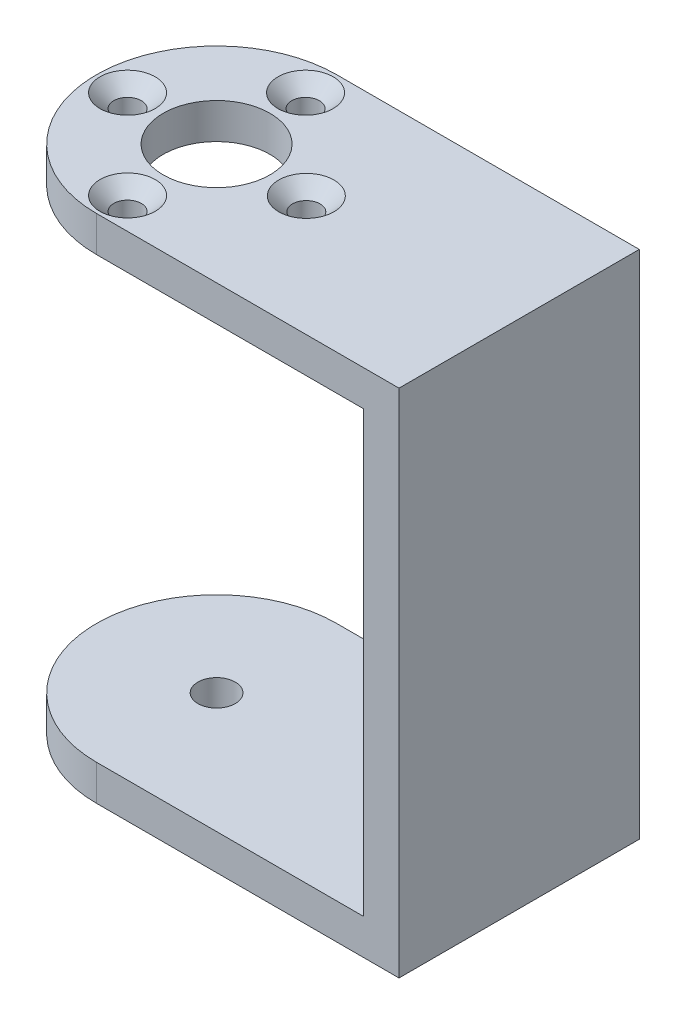
ISO-10303-21;
HEADER;
FILE_DESCRIPTION(('STEP AP214'),'2;1');
FILE_NAME('part.step','',(''),(''),'','','');
FILE_SCHEMA(('AUTOMOTIVE_DESIGN { 1 0 10303 214 1 1 1 1 }'));
ENDSEC;
DATA;
#1=APPLICATION_CONTEXT('core data for automotive mechanical design processes');
#2=APPLICATION_PROTOCOL_DEFINITION('international standard','automotive_design',2000,#1);
#3=PRODUCT_CONTEXT('',#1,'mechanical');
#4=PRODUCT('Part','Part','',(#3));
#5=PRODUCT_RELATED_PRODUCT_CATEGORY('part','',(#4));
#6=PRODUCT_DEFINITION_FORMATION('','',#4);
#7=PRODUCT_DEFINITION_CONTEXT('part definition',#1,'design');
#8=PRODUCT_DEFINITION('design','',#6,#7);
#9=PRODUCT_DEFINITION_SHAPE('','',#8);
#10=(LENGTH_UNIT() NAMED_UNIT(*) SI_UNIT(.MILLI.,.METRE.));
#11=(NAMED_UNIT(*) PLANE_ANGLE_UNIT() SI_UNIT($,.RADIAN.));
#12=(NAMED_UNIT(*) SI_UNIT($,.STERADIAN.) SOLID_ANGLE_UNIT());
#13=UNCERTAINTY_MEASURE_WITH_UNIT(LENGTH_MEASURE(1.E-05),#10,'distance_accuracy_value','');
#14=(GEOMETRIC_REPRESENTATION_CONTEXT(3) GLOBAL_UNCERTAINTY_ASSIGNED_CONTEXT((#13)) GLOBAL_UNIT_ASSIGNED_CONTEXT((#10,
#11,#12)) REPRESENTATION_CONTEXT('',''));
#15=CARTESIAN_POINT('',(0.,0.,0.));
#16=DIRECTION('',(0.,0.,1.));
#17=DIRECTION('',(1.,0.,0.));
#18=AXIS2_PLACEMENT_3D('',#15,#16,#17);
#19=CARTESIAN_POINT('',(22.8357313979077,-29.6397523900537,-4.21317592186477));
#20=DIRECTION('',(0.,-1.,0.));
#21=DIRECTION('',(0.,0.,-1.));
#22=AXIS2_PLACEMENT_3D('',#19,#20,#21);
#23=CYLINDRICAL_SURFACE('',#22,2.1);
#24=CARTESIAN_POINT('',(22.8357313979077,-25.6397523900537,-4.21317592186477));
#25=DIRECTION('',(0.,-1.,0.));
#26=DIRECTION('',(0.,0.,-1.));
#27=AXIS2_PLACEMENT_3D('',#24,#25,#26);
#28=CIRCLE('',#27,2.1);
#29=CARTESIAN_POINT('',(22.8357313979077,-25.6397523900537,-6.31317592186477));
#30=VERTEX_POINT('',#29);
#31=EDGE_CURVE('E396',#30,#30,#28,.F.);
#32=ORIENTED_EDGE('',*,*,#31,.T.);
#33=EDGE_LOOP('',(#32));
#34=FACE_BOUND('',#33,.T.);
#35=CARTESIAN_POINT('',(22.8357313979077,-28.6397523900537,-4.21317592186477));
#36=DIRECTION('',(0.,-1.,0.));
#37=DIRECTION('',(0.,0.,-1.));
#38=AXIS2_PLACEMENT_3D('',#35,#36,#37);
#39=CIRCLE('',#38,2.1);
#40=CARTESIAN_POINT('',(22.8357313979077,-28.6397523900537,-6.31317592186477));
#41=VERTEX_POINT('',#40);
#42=EDGE_CURVE('E143',#41,#41,#39,.F.);
#43=ORIENTED_EDGE('',*,*,#42,.F.);
#44=EDGE_LOOP('',(#43));
#45=FACE_BOUND('',#44,.T.);
#46=ADVANCED_FACE('F59',(#34,#45),#23,.F.);
#47=CARTESIAN_POINT('',(52.8357313979077,0.,0.));
#48=DIRECTION('',(1.,0.,0.));
#49=DIRECTION('',(0.,0.,-1.));
#50=AXIS2_PLACEMENT_3D('',#47,#48,#49);
#51=PLANE('',#50);
#52=DIRECTION('',(0.,0.,1.));
#53=VECTOR('',#52,1.);
#54=CARTESIAN_POINT('',(52.8357313979077,23.7602476099463,-17.7131759218648));
#55=LINE('',#54,#53);
#56=CARTESIAN_POINT('',(52.8357313979077,23.7602476099463,-17.7131759218648));
#57=VERTEX_POINT('',#56);
#58=CARTESIAN_POINT('',(52.8357313979077,23.7602476099463,9.28682407813523));
#59=VERTEX_POINT('',#58);
#60=EDGE_CURVE('E196',#57,#59,#55,.T.);
#61=ORIENTED_EDGE('',*,*,#60,.F.);
#62=DIRECTION('',(0.,1.,0.));
#63=VECTOR('',#62,1.);
#64=CARTESIAN_POINT('',(52.8357313979077,27.7602476099463,-17.7131759218648));
#65=LINE('',#64,#63);
#66=CARTESIAN_POINT('',(52.8357313979077,-25.6397523900537,-17.7131759218648));
#67=VERTEX_POINT('',#66);
#68=EDGE_CURVE('E236',#67,#57,#65,.T.);
#69=ORIENTED_EDGE('',*,*,#68,.F.);
#70=DIRECTION('',(0.,0.,1.));
#71=VECTOR('',#70,1.);
#72=CARTESIAN_POINT('',(52.8357313979077,-25.6397523900537,-17.7131759218648));
#73=LINE('',#72,#71);
#74=CARTESIAN_POINT('',(52.8357313979077,-25.6397523900537,9.28682407813522));
#75=VERTEX_POINT('',#74);
#76=EDGE_CURVE('E120',#67,#75,#73,.T.);
#77=ORIENTED_EDGE('',*,*,#76,.T.);
#78=DIRECTION('',(0.,-1.,0.));
#79=VECTOR('',#78,1.);
#80=CARTESIAN_POINT('',(52.8357313979077,27.7602476099463,9.28682407813523));
#81=LINE('',#80,#79);
#82=EDGE_CURVE('E95',#59,#75,#81,.T.);
#83=ORIENTED_EDGE('',*,*,#82,.F.);
#84=EDGE_LOOP('',(#61,#69,#77,#83));
#85=FACE_BOUND('',#84,.T.);
#86=ADVANCED_FACE('F283',(#85),#51,.F.);
#87=CARTESIAN_POINT('',(22.8357313979077,-25.6397523900537,-4.21317592186477));
#88=DIRECTION('',(0.,-1.,0.));
#89=DIRECTION('',(0.,0.,-1.));
#90=AXIS2_PLACEMENT_3D('',#87,#88,#89);
#91=CYLINDRICAL_SURFACE('',#90,13.5);
#92=CARTESIAN_POINT('',(22.8357313979077,-29.6397523900537,-4.21317592186477));
#93=DIRECTION('',(0.,-1.,0.));
#94=DIRECTION('',(0.,0.,-1.));
#95=AXIS2_PLACEMENT_3D('',#92,#93,#94);
#96=CIRCLE('',#95,13.5);
#97=CARTESIAN_POINT('',(22.8357313979077,-29.6397523900537,9.28682407813523));
#98=VERTEX_POINT('',#97);
#99=CARTESIAN_POINT('',(22.8357313979077,-29.6397523900537,-17.7131759218648));
#100=VERTEX_POINT('',#99);
#101=EDGE_CURVE('E138',#98,#100,#96,.T.);
#102=ORIENTED_EDGE('',*,*,#101,.F.);
#103=DIRECTION('',(0.,-1.,0.));
#104=VECTOR('',#103,1.);
#105=CARTESIAN_POINT('',(22.8357313979077,-25.6397523900537,9.28682407813523));
#106=LINE('',#105,#104);
#107=CARTESIAN_POINT('',(22.8357313979077,-25.6397523900537,9.28682407813523));
#108=VERTEX_POINT('',#107);
#109=EDGE_CURVE('E12',#108,#98,#106,.T.);
#110=ORIENTED_EDGE('',*,*,#109,.F.);
#111=CARTESIAN_POINT('',(22.8357313979077,-25.6397523900537,-4.21317592186477));
#112=DIRECTION('',(0.,-1.,0.));
#113=DIRECTION('',(0.,0.,-1.));
#114=AXIS2_PLACEMENT_3D('',#111,#112,#113);
#115=CIRCLE('',#114,13.5);
#116=CARTESIAN_POINT('',(22.8357313979077,-25.6397523900537,-17.7131759218648));
#117=VERTEX_POINT('',#116);
#118=EDGE_CURVE('E118',#108,#117,#115,.T.);
#119=ORIENTED_EDGE('',*,*,#118,.T.);
#120=DIRECTION('',(0.,-1.,0.));
#121=VECTOR('',#120,1.);
#122=CARTESIAN_POINT('',(22.8357313979077,-25.6397523900537,-17.7131759218648));
#123=LINE('',#122,#121);
#124=EDGE_CURVE('E70',#117,#100,#123,.T.);
#125=ORIENTED_EDGE('',*,*,#124,.T.);
#126=EDGE_LOOP('',(#102,#110,#119,#125));
#127=FACE_BOUND('',#126,.T.);
#128=ADVANCED_FACE('F123',(#127),#91,.T.);
#129=CARTESIAN_POINT('',(52.8357313979077,-25.6397523900537,9.28682407813523));
#130=DIRECTION('',(0.,0.,1.));
#131=DIRECTION('',(1.,0.,0.));
#132=AXIS2_PLACEMENT_3D('',#129,#130,#131);
#133=PLANE('',#132);
#134=DIRECTION('',(-1.,0.,0.));
#135=VECTOR('',#134,1.);
#136=CARTESIAN_POINT('',(52.8357313979077,-29.6397523900537,9.28682407813523));
#137=LINE('',#136,#135);
#138=CARTESIAN_POINT('',(56.8357313979077,-29.6397523900537,9.28682407813522));
#139=VERTEX_POINT('',#138);
#140=EDGE_CURVE('E125',#139,#98,#137,.T.);
#141=ORIENTED_EDGE('',*,*,#140,.F.);
#142=DIRECTION('',(0.,-1.,0.));
#143=VECTOR('',#142,1.);
#144=CARTESIAN_POINT('',(56.8357313979077,27.7602476099463,9.28682407813523));
#145=LINE('',#144,#143);
#146=CARTESIAN_POINT('',(56.8357313979077,27.7602476099463,9.28682407813523));
#147=VERTEX_POINT('',#146);
#148=EDGE_CURVE('E231',#147,#139,#145,.T.);
#149=ORIENTED_EDGE('',*,*,#148,.F.);
#150=DIRECTION('',(-1.,0.,0.));
#151=VECTOR('',#150,1.);
#152=CARTESIAN_POINT('',(56.8357313979077,27.7602476099463,9.28682407813523));
#153=LINE('',#152,#151);
#154=CARTESIAN_POINT('',(22.8357313979077,27.7602476099463,9.28682407813523));
#155=VERTEX_POINT('',#154);
#156=EDGE_CURVE('E247',#147,#155,#153,.T.);
#157=ORIENTED_EDGE('',*,*,#156,.T.);
#158=DIRECTION('',(0.,1.,0.));
#159=VECTOR('',#158,1.);
#160=CARTESIAN_POINT('',(22.8357313979077,-16.6006245312748,9.28682407813523));
#161=LINE('',#160,#159);
#162=CARTESIAN_POINT('',(22.8357313979077,23.7602476099463,9.28682407813523));
#163=VERTEX_POINT('',#162);
#164=EDGE_CURVE('E147',#163,#155,#161,.T.);
#165=ORIENTED_EDGE('',*,*,#164,.F.);
#166=DIRECTION('',(-1.,0.,0.));
#167=VECTOR('',#166,1.);
#168=CARTESIAN_POINT('',(52.8357313979077,23.7602476099463,9.28682407813523));
#169=LINE('',#168,#167);
#170=EDGE_CURVE('E205',#59,#163,#169,.T.);
#171=ORIENTED_EDGE('',*,*,#170,.F.);
#172=ORIENTED_EDGE('',*,*,#82,.T.);
#173=DIRECTION('',(-1.,0.,0.));
#174=VECTOR('',#173,1.);
#175=CARTESIAN_POINT('',(52.8357313979077,-25.6397523900537,9.28682407813523));
#176=LINE('',#175,#174);
#177=EDGE_CURVE('E113',#75,#108,#176,.T.);
#178=ORIENTED_EDGE('',*,*,#177,.T.);
#179=ORIENTED_EDGE('',*,*,#109,.T.);
#180=EDGE_LOOP('',(#141,#149,#157,#165,#171,#172,#178,#179));
#181=FACE_BOUND('',#180,.T.);
#182=ADVANCED_FACE('F296',(#181),#133,.T.);
#183=CARTESIAN_POINT('',(22.8357313979077,-25.6397523900537,-17.7131759218648));
#184=DIRECTION('',(0.,0.,-1.));
#185=DIRECTION('',(-1.,0.,0.));
#186=AXIS2_PLACEMENT_3D('',#183,#184,#185);
#187=PLANE('',#186);
#188=DIRECTION('',(1.,0.,0.));
#189=VECTOR('',#188,1.);
#190=CARTESIAN_POINT('',(22.8357313979077,-29.6397523900537,-17.7131759218648));
#191=LINE('',#190,#189);
#192=CARTESIAN_POINT('',(56.8357313979077,-29.6397523900537,-17.7131759218648));
#193=VERTEX_POINT('',#192);
#194=EDGE_CURVE('E110',#100,#193,#191,.T.);
#195=ORIENTED_EDGE('',*,*,#194,.F.);
#196=ORIENTED_EDGE('',*,*,#124,.F.);
#197=DIRECTION('',(1.,0.,0.));
#198=VECTOR('',#197,1.);
#199=CARTESIAN_POINT('',(22.8357313979077,-25.6397523900537,-17.7131759218648));
#200=LINE('',#199,#198);
#201=EDGE_CURVE('E106',#117,#67,#200,.T.);
#202=ORIENTED_EDGE('',*,*,#201,.T.);
#203=ORIENTED_EDGE('',*,*,#68,.T.);
#204=DIRECTION('',(1.,0.,0.));
#205=VECTOR('',#204,1.);
#206=CARTESIAN_POINT('',(22.8357313979077,23.7602476099463,-17.7131759218648));
#207=LINE('',#206,#205);
#208=CARTESIAN_POINT('',(22.8357313979077,23.7602476099463,-17.7131759218648));
#209=VERTEX_POINT('',#208);
#210=EDGE_CURVE('E200',#209,#57,#207,.T.);
#211=ORIENTED_EDGE('',*,*,#210,.F.);
#212=DIRECTION('',(0.,1.,0.));
#213=VECTOR('',#212,1.);
#214=CARTESIAN_POINT('',(22.8357313979077,-16.6006245312748,-17.7131759218648));
#215=LINE('',#214,#213);
#216=CARTESIAN_POINT('',(22.8357313979077,27.7602476099463,-17.7131759218648));
#217=VERTEX_POINT('',#216);
#218=EDGE_CURVE('E201',#209,#217,#215,.T.);
#219=ORIENTED_EDGE('',*,*,#218,.T.);
#220=DIRECTION('',(-1.,0.,0.));
#221=VECTOR('',#220,1.);
#222=CARTESIAN_POINT('',(56.8357313979077,27.7602476099463,-17.7131759218648));
#223=LINE('',#222,#221);
#224=CARTESIAN_POINT('',(56.8357313979077,27.7602476099463,-17.7131759218648));
#225=VERTEX_POINT('',#224);
#226=EDGE_CURVE('E131',#225,#217,#223,.T.);
#227=ORIENTED_EDGE('',*,*,#226,.F.);
#228=DIRECTION('',(0.,1.,0.));
#229=VECTOR('',#228,1.);
#230=CARTESIAN_POINT('',(56.8357313979077,27.7602476099463,-17.7131759218648));
#231=LINE('',#230,#229);
#232=EDGE_CURVE('E240',#193,#225,#231,.T.);
#233=ORIENTED_EDGE('',*,*,#232,.F.);
#234=EDGE_LOOP('',(#195,#196,#202,#203,#211,#219,#227,#233));
#235=FACE_BOUND('',#234,.T.);
#236=ADVANCED_FACE('F104',(#235),#187,.T.);
#237=CARTESIAN_POINT('',(22.8357313979077,-25.6397523900537,-4.21317592186477));
#238=DIRECTION('',(0.,-1.,0.));
#239=DIRECTION('',(0.,0.,-1.));
#240=AXIS2_PLACEMENT_3D('',#237,#238,#239);
#241=PLANE('',#240);
#242=ORIENTED_EDGE('',*,*,#118,.F.);
#243=ORIENTED_EDGE('',*,*,#177,.F.);
#244=ORIENTED_EDGE('',*,*,#76,.F.);
#245=ORIENTED_EDGE('',*,*,#201,.F.);
#246=EDGE_LOOP('',(#242,#243,#244,#245));
#247=FACE_BOUND('',#246,.T.);
#248=ORIENTED_EDGE('',*,*,#31,.F.);
#249=EDGE_LOOP('',(#248));
#250=FACE_BOUND('',#249,.T.);
#251=ADVANCED_FACE('F116',(#247,#250),#241,.F.);
#252=CARTESIAN_POINT('',(22.8357313979077,-29.6397523900537,-4.2131759218647));
#253=DIRECTION('',(0.,-1.,0.));
#254=DIRECTION('',(0.,0.,-1.));
#255=AXIS2_PLACEMENT_3D('',#252,#253,#254);
#256=PLANE('',#255);
#257=CARTESIAN_POINT('',(22.8357313979077,-29.6397523900537,-4.21317592186477));
#258=DIRECTION('',(0.,-1.,0.));
#259=DIRECTION('',(0.,0.,-1.));
#260=AXIS2_PLACEMENT_3D('',#257,#258,#259);
#261=CIRCLE('',#260,4.);
#262=CARTESIAN_POINT('',(22.8357313979077,-29.6397523900537,-8.21317592186477));
#263=VERTEX_POINT('',#262);
#264=EDGE_CURVE('E153',#263,#263,#261,.T.);
#265=ORIENTED_EDGE('',*,*,#264,.F.);
#266=EDGE_LOOP('',(#265));
#267=FACE_BOUND('',#266,.T.);
#268=ORIENTED_EDGE('',*,*,#101,.T.);
#269=ORIENTED_EDGE('',*,*,#194,.T.);
#270=DIRECTION('',(0.,0.,-1.));
#271=VECTOR('',#270,1.);
#272=CARTESIAN_POINT('',(56.8357313979077,-29.6397523900537,9.28682407813522));
#273=LINE('',#272,#271);
#274=EDGE_CURVE('E235',#139,#193,#273,.T.);
#275=ORIENTED_EDGE('',*,*,#274,.F.);
#276=ORIENTED_EDGE('',*,*,#140,.T.);
#277=EDGE_LOOP('',(#268,#269,#275,#276));
#278=FACE_BOUND('',#277,.T.);
#279=ADVANCED_FACE('F61',(#267,#278),#256,.T.);
#280=CARTESIAN_POINT('',(56.8357313979077,27.7602476099463,9.28682407813523));
#281=DIRECTION('',(0.,-1.,0.));
#282=DIRECTION('',(0.,0.,-1.));
#283=AXIS2_PLACEMENT_3D('',#280,#281,#282);
#284=PLANE('',#283);
#285=CARTESIAN_POINT('',(22.8357313979077,27.7602476099463,-14.2131759218647));
#286=DIRECTION('',(0.,1.,0.));
#287=DIRECTION('',(0.,0.,1.));
#288=AXIS2_PLACEMENT_3D('',#285,#286,#287);
#289=CIRCLE('',#288,3.1);
#290=CARTESIAN_POINT('',(22.8357313979077,27.7602476099463,-11.1131759218647));
#291=VERTEX_POINT('',#290);
#292=EDGE_CURVE('E394',#291,#291,#289,.T.);
#293=ORIENTED_EDGE('',*,*,#292,.F.);
#294=EDGE_LOOP('',(#293));
#295=FACE_BOUND('',#294,.T.);
#296=CARTESIAN_POINT('',(12.8357313979077,27.7602476099463,-4.2131759218647));
#297=DIRECTION('',(0.,1.,0.));
#298=DIRECTION('',(0.,0.,1.));
#299=AXIS2_PLACEMENT_3D('',#296,#297,#298);
#300=CIRCLE('',#299,3.1);
#301=CARTESIAN_POINT('',(12.8357313979077,27.7602476099463,-1.1131759218647));
#302=VERTEX_POINT('',#301);
#303=EDGE_CURVE('E172',#302,#302,#300,.T.);
#304=ORIENTED_EDGE('',*,*,#303,.F.);
#305=EDGE_LOOP('',(#304));
#306=FACE_BOUND('',#305,.T.);
#307=CARTESIAN_POINT('',(22.8357313979077,27.7602476099463,5.7868240781353));
#308=DIRECTION('',(0.,1.,0.));
#309=DIRECTION('',(0.,0.,1.));
#310=AXIS2_PLACEMENT_3D('',#307,#308,#309);
#311=CIRCLE('',#310,3.1);
#312=CARTESIAN_POINT('',(22.8357313979077,27.7602476099463,8.8868240781353));
#313=VERTEX_POINT('',#312);
#314=EDGE_CURVE('E163',#313,#313,#311,.T.);
#315=ORIENTED_EDGE('',*,*,#314,.F.);
#316=EDGE_LOOP('',(#315));
#317=FACE_BOUND('',#316,.T.);
#318=CARTESIAN_POINT('',(32.9217404089077,27.7602476099463,-4.2131759218647));
#319=DIRECTION('',(0.,1.,0.));
#320=DIRECTION('',(0.,0.,1.));
#321=AXIS2_PLACEMENT_3D('',#318,#319,#320);
#322=CIRCLE('',#321,3.1);
#323=CARTESIAN_POINT('',(32.9217404089077,27.7602476099463,-1.1131759218647));
#324=VERTEX_POINT('',#323);
#325=EDGE_CURVE('E158',#324,#324,#322,.T.);
#326=ORIENTED_EDGE('',*,*,#325,.F.);
#327=EDGE_LOOP('',(#326));
#328=FACE_BOUND('',#327,.T.);
#329=ORIENTED_EDGE('',*,*,#226,.T.);
#330=CARTESIAN_POINT('',(22.8357313979077,27.7602476099463,-4.21317592186477));
#331=DIRECTION('',(0.,1.,0.));
#332=DIRECTION('',(0.,0.,1.));
#333=AXIS2_PLACEMENT_3D('',#330,#331,#332);
#334=CIRCLE('',#333,13.5);
#335=EDGE_CURVE('E224',#217,#155,#334,.T.);
#336=ORIENTED_EDGE('',*,*,#335,.T.);
#337=ORIENTED_EDGE('',*,*,#156,.F.);
#338=DIRECTION('',(0.,0.,1.));
#339=VECTOR('',#338,1.);
#340=CARTESIAN_POINT('',(56.8357313979077,27.7602476099463,9.28682407813523));
#341=LINE('',#340,#339);
#342=EDGE_CURVE('E244',#225,#147,#341,.T.);
#343=ORIENTED_EDGE('',*,*,#342,.F.);
#344=EDGE_LOOP('',(#329,#336,#337,#343));
#345=FACE_BOUND('',#344,.T.);
#346=CARTESIAN_POINT('',(22.8357313979077,27.7602476099463,-4.21317592186477));
#347=DIRECTION('',(0.,1.,0.));
#348=DIRECTION('',(0.,0.,1.));
#349=AXIS2_PLACEMENT_3D('',#346,#347,#348);
#350=CIRCLE('',#349,6.);
#351=CARTESIAN_POINT('',(22.8357313979077,27.7602476099463,1.78682407813523));
#352=VERTEX_POINT('',#351);
#353=EDGE_CURVE('E216',#352,#352,#350,.T.);
#354=ORIENTED_EDGE('',*,*,#353,.F.);
#355=EDGE_LOOP('',(#354));
#356=FACE_BOUND('',#355,.T.);
#357=ADVANCED_FACE('F264',(#295,#306,#317,#328,#345,#356),#284,.F.);
#358=CARTESIAN_POINT('',(56.8357313979077,0.,0.));
#359=DIRECTION('',(1.,0.,0.));
#360=DIRECTION('',(0.,0.,-1.));
#361=AXIS2_PLACEMENT_3D('',#358,#359,#360);
#362=PLANE('',#361);
#363=ORIENTED_EDGE('',*,*,#148,.T.);
#364=ORIENTED_EDGE('',*,*,#274,.T.);
#365=ORIENTED_EDGE('',*,*,#232,.T.);
#366=ORIENTED_EDGE('',*,*,#342,.T.);
#367=EDGE_LOOP('',(#363,#364,#365,#366));
#368=FACE_BOUND('',#367,.T.);
#369=ADVANCED_FACE('F293',(#368),#362,.T.);
#370=CARTESIAN_POINT('',(22.8357313979077,23.7602476099463,-4.21317592186477));
#371=DIRECTION('',(0.,1.,0.));
#372=DIRECTION('',(0.,0.,1.));
#373=AXIS2_PLACEMENT_3D('',#370,#371,#372);
#374=PLANE('',#373);
#375=CARTESIAN_POINT('',(22.8357313979077,23.7602476099463,-14.2131759218647));
#376=DIRECTION('',(0.,1.,0.));
#377=DIRECTION('',(0.,0.,1.));
#378=AXIS2_PLACEMENT_3D('',#375,#376,#377);
#379=CIRCLE('',#378,1.55);
#380=CARTESIAN_POINT('',(22.8357313979077,23.7602476099463,-12.6631759218647));
#381=VERTEX_POINT('',#380);
#382=EDGE_CURVE('E63',#381,#381,#379,.T.);
#383=ORIENTED_EDGE('',*,*,#382,.T.);
#384=EDGE_LOOP('',(#383));
#385=FACE_BOUND('',#384,.T.);
#386=CARTESIAN_POINT('',(12.8357313979077,23.7602476099463,-4.2131759218647));
#387=DIRECTION('',(0.,1.,0.));
#388=DIRECTION('',(0.,0.,1.));
#389=AXIS2_PLACEMENT_3D('',#386,#387,#388);
#390=CIRCLE('',#389,1.55);
#391=CARTESIAN_POINT('',(12.8357313979077,23.7602476099463,-2.6631759218647));
#392=VERTEX_POINT('',#391);
#393=EDGE_CURVE('E160',#392,#392,#390,.T.);
#394=ORIENTED_EDGE('',*,*,#393,.T.);
#395=EDGE_LOOP('',(#394));
#396=FACE_BOUND('',#395,.T.);
#397=CARTESIAN_POINT('',(22.8357313979077,23.7602476099463,5.7868240781353));
#398=DIRECTION('',(0.,1.,0.));
#399=DIRECTION('',(0.,0.,1.));
#400=AXIS2_PLACEMENT_3D('',#397,#398,#399);
#401=CIRCLE('',#400,1.55);
#402=CARTESIAN_POINT('',(22.8357313979077,23.7602476099463,7.3368240781353));
#403=VERTEX_POINT('',#402);
#404=EDGE_CURVE('E155',#403,#403,#401,.T.);
#405=ORIENTED_EDGE('',*,*,#404,.T.);
#406=EDGE_LOOP('',(#405));
#407=FACE_BOUND('',#406,.T.);
#408=CARTESIAN_POINT('',(32.9217404089077,23.7602476099463,-4.2131759218647));
#409=DIRECTION('',(0.,1.,0.));
#410=DIRECTION('',(0.,0.,1.));
#411=AXIS2_PLACEMENT_3D('',#408,#409,#410);
#412=CIRCLE('',#411,1.55);
#413=CARTESIAN_POINT('',(32.9217404089077,23.7602476099463,-2.6631759218647));
#414=VERTEX_POINT('',#413);
#415=EDGE_CURVE('E149',#414,#414,#412,.T.);
#416=ORIENTED_EDGE('',*,*,#415,.T.);
#417=EDGE_LOOP('',(#416));
#418=FACE_BOUND('',#417,.T.);
#419=CARTESIAN_POINT('',(22.8357313979077,23.7602476099463,-4.21317592186477));
#420=DIRECTION('',(0.,1.,0.));
#421=DIRECTION('',(0.,0.,1.));
#422=AXIS2_PLACEMENT_3D('',#419,#420,#421);
#423=CIRCLE('',#422,13.5);
#424=EDGE_CURVE('E220',#209,#163,#423,.T.);
#425=ORIENTED_EDGE('',*,*,#424,.F.);
#426=ORIENTED_EDGE('',*,*,#210,.T.);
#427=ORIENTED_EDGE('',*,*,#60,.T.);
#428=ORIENTED_EDGE('',*,*,#170,.T.);
#429=EDGE_LOOP('',(#425,#426,#427,#428));
#430=FACE_BOUND('',#429,.T.);
#431=CARTESIAN_POINT('',(22.8357313979077,23.7602476099463,-4.21317592186477));
#432=DIRECTION('',(0.,1.,0.));
#433=DIRECTION('',(0.,0.,1.));
#434=AXIS2_PLACEMENT_3D('',#431,#432,#433);
#435=CIRCLE('',#434,6.);
#436=CARTESIAN_POINT('',(22.8357313979077,23.7602476099463,1.78682407813523));
#437=VERTEX_POINT('',#436);
#438=EDGE_CURVE('E215',#437,#437,#435,.T.);
#439=ORIENTED_EDGE('',*,*,#438,.T.);
#440=EDGE_LOOP('',(#439));
#441=FACE_BOUND('',#440,.T.);
#442=ADVANCED_FACE('F279',(#385,#396,#407,#418,#430,#441),#374,.F.);
#443=CARTESIAN_POINT('',(22.8357313979077,27.7602476099463,-4.21317592186477));
#444=DIRECTION('',(0.,-1.,0.));
#445=DIRECTION('',(0.,0.,-1.));
#446=AXIS2_PLACEMENT_3D('',#443,#444,#445);
#447=CYLINDRICAL_SURFACE('',#446,13.5);
#448=ORIENTED_EDGE('',*,*,#335,.F.);
#449=ORIENTED_EDGE('',*,*,#218,.F.);
#450=ORIENTED_EDGE('',*,*,#424,.T.);
#451=ORIENTED_EDGE('',*,*,#164,.T.);
#452=EDGE_LOOP('',(#448,#449,#450,#451));
#453=FACE_BOUND('',#452,.T.);
#454=ADVANCED_FACE('F270',(#453),#447,.T.);
#455=CARTESIAN_POINT('',(22.8357313979077,27.7602476099463,-4.21317592186477));
#456=DIRECTION('',(0.,-1.,0.));
#457=DIRECTION('',(0.,0.,-1.));
#458=AXIS2_PLACEMENT_3D('',#455,#456,#457);
#459=CYLINDRICAL_SURFACE('',#458,6.);
#460=ORIENTED_EDGE('',*,*,#353,.T.);
#461=EDGE_LOOP('',(#460));
#462=FACE_BOUND('',#461,.T.);
#463=ORIENTED_EDGE('',*,*,#438,.F.);
#464=EDGE_LOOP('',(#463));
#465=FACE_BOUND('',#464,.T.);
#466=ADVANCED_FACE('F321',(#462,#465),#459,.F.);
#467=CARTESIAN_POINT('',(22.8357313979077,-28.6397523900537,-4.2131759218647));
#468=DIRECTION('',(0.,-1.,0.));
#469=DIRECTION('',(0.,0.,-1.));
#470=AXIS2_PLACEMENT_3D('',#467,#468,#469);
#471=PLANE('',#470);
#472=CARTESIAN_POINT('',(22.8357313979077,-28.6397523900537,-4.21317592186477));
#473=DIRECTION('',(0.,-1.,0.));
#474=DIRECTION('',(0.,0.,-1.));
#475=AXIS2_PLACEMENT_3D('',#472,#473,#474);
#476=CIRCLE('',#475,4.);
#477=CARTESIAN_POINT('',(22.8357313979077,-28.6397523900537,-8.21317592186477));
#478=VERTEX_POINT('',#477);
#479=EDGE_CURVE('E148',#478,#478,#476,.F.);
#480=ORIENTED_EDGE('',*,*,#479,.F.);
#481=EDGE_LOOP('',(#480));
#482=FACE_BOUND('',#481,.T.);
#483=ORIENTED_EDGE('',*,*,#42,.T.);
#484=EDGE_LOOP('',(#483));
#485=FACE_BOUND('',#484,.T.);
#486=ADVANCED_FACE('F324',(#482,#485),#471,.T.);
#487=CARTESIAN_POINT('',(22.8357313979077,-13.8260438910689,-4.21317592186477));
#488=DIRECTION('',(0.,-1.,0.));
#489=DIRECTION('',(0.,0.,-1.));
#490=AXIS2_PLACEMENT_3D('',#487,#488,#489);
#491=CYLINDRICAL_SURFACE('',#490,4.);
#492=ORIENTED_EDGE('',*,*,#479,.T.);
#493=EDGE_LOOP('',(#492));
#494=FACE_BOUND('',#493,.T.);
#495=ORIENTED_EDGE('',*,*,#264,.T.);
#496=EDGE_LOOP('',(#495));
#497=FACE_BOUND('',#496,.T.);
#498=ADVANCED_FACE('F319',(#494,#497),#491,.F.);
#499=CARTESIAN_POINT('',(32.9217404089077,27.7602476099463,-4.2131759218647));
#500=DIRECTION('',(0.,1.,0.));
#501=DIRECTION('',(0.,0.,1.));
#502=AXIS2_PLACEMENT_3D('',#499,#500,#501);
#503=CYLINDRICAL_SURFACE('',#502,1.55);
#504=CARTESIAN_POINT('',(32.9217404089077,26.2102476099463,-4.2131759218647));
#505=DIRECTION('',(0.,1.,0.));
#506=DIRECTION('',(0.,0.,1.));
#507=AXIS2_PLACEMENT_3D('',#504,#505,#506);
#508=CIRCLE('',#507,1.55);
#509=CARTESIAN_POINT('',(32.9217404089077,26.2102476099463,-2.6631759218647));
#510=VERTEX_POINT('',#509);
#511=EDGE_CURVE('E154',#510,#510,#508,.T.);
#512=ORIENTED_EDGE('',*,*,#511,.T.);
#513=EDGE_LOOP('',(#512));
#514=FACE_BOUND('',#513,.T.);
#515=ORIENTED_EDGE('',*,*,#415,.F.);
#516=EDGE_LOOP('',(#515));
#517=FACE_BOUND('',#516,.T.);
#518=ADVANCED_FACE('F346',(#514,#517),#503,.F.);
#519=CARTESIAN_POINT('',(32.9217404089077,27.7602476099463,-4.2131759218647));
#520=DIRECTION('',(0.,1.,0.));
#521=DIRECTION('',(0.,0.,1.));
#522=AXIS2_PLACEMENT_3D('',#519,#520,#521);
#523=CONICAL_SURFACE('',#522,3.1,0.785398163397449);
#524=ORIENTED_EDGE('',*,*,#511,.F.);
#525=EDGE_LOOP('',(#524));
#526=FACE_BOUND('',#525,.T.);
#527=ORIENTED_EDGE('',*,*,#325,.T.);
#528=EDGE_LOOP('',(#527));
#529=FACE_BOUND('',#528,.T.);
#530=ADVANCED_FACE('F352',(#526,#529),#523,.F.);
#531=CARTESIAN_POINT('',(22.8357313979077,27.7602476099463,5.7868240781353));
#532=DIRECTION('',(0.,1.,0.));
#533=DIRECTION('',(0.,0.,1.));
#534=AXIS2_PLACEMENT_3D('',#531,#532,#533);
#535=CYLINDRICAL_SURFACE('',#534,1.55);
#536=CARTESIAN_POINT('',(22.8357313979077,26.2102476099463,5.7868240781353));
#537=DIRECTION('',(0.,1.,0.));
#538=DIRECTION('',(0.,0.,1.));
#539=AXIS2_PLACEMENT_3D('',#536,#537,#538);
#540=CIRCLE('',#539,1.55);
#541=CARTESIAN_POINT('',(22.8357313979077,26.2102476099463,7.3368240781353));
#542=VERTEX_POINT('',#541);
#543=EDGE_CURVE('E159',#542,#542,#540,.T.);
#544=ORIENTED_EDGE('',*,*,#543,.T.);
#545=EDGE_LOOP('',(#544));
#546=FACE_BOUND('',#545,.T.);
#547=ORIENTED_EDGE('',*,*,#404,.F.);
#548=EDGE_LOOP('',(#547));
#549=FACE_BOUND('',#548,.T.);
#550=ADVANCED_FACE('F364',(#546,#549),#535,.F.);
#551=CARTESIAN_POINT('',(22.8357313979077,27.7602476099463,5.7868240781353));
#552=DIRECTION('',(0.,1.,0.));
#553=DIRECTION('',(0.,0.,1.));
#554=AXIS2_PLACEMENT_3D('',#551,#552,#553);
#555=CONICAL_SURFACE('',#554,3.1,0.785398163397448);
#556=ORIENTED_EDGE('',*,*,#543,.F.);
#557=EDGE_LOOP('',(#556));
#558=FACE_BOUND('',#557,.T.);
#559=ORIENTED_EDGE('',*,*,#314,.T.);
#560=EDGE_LOOP('',(#559));
#561=FACE_BOUND('',#560,.T.);
#562=ADVANCED_FACE('F368',(#558,#561),#555,.F.);
#563=CARTESIAN_POINT('',(12.8357313979077,27.7602476099463,-4.2131759218647));
#564=DIRECTION('',(0.,1.,0.));
#565=DIRECTION('',(0.,0.,1.));
#566=AXIS2_PLACEMENT_3D('',#563,#564,#565);
#567=CYLINDRICAL_SURFACE('',#566,1.55);
#568=CARTESIAN_POINT('',(12.8357313979077,26.2102476099463,-4.2131759218647));
#569=DIRECTION('',(0.,1.,0.));
#570=DIRECTION('',(0.,0.,1.));
#571=AXIS2_PLACEMENT_3D('',#568,#569,#570);
#572=CIRCLE('',#571,1.55);
#573=CARTESIAN_POINT('',(12.8357313979077,26.2102476099463,-2.6631759218647));
#574=VERTEX_POINT('',#573);
#575=EDGE_CURVE('E164',#574,#574,#572,.T.);
#576=ORIENTED_EDGE('',*,*,#575,.T.);
#577=EDGE_LOOP('',(#576));
#578=FACE_BOUND('',#577,.T.);
#579=ORIENTED_EDGE('',*,*,#393,.F.);
#580=EDGE_LOOP('',(#579));
#581=FACE_BOUND('',#580,.T.);
#582=ADVANCED_FACE('F372',(#578,#581),#567,.F.);
#583=CARTESIAN_POINT('',(12.8357313979077,27.7602476099463,-4.2131759218647));
#584=DIRECTION('',(0.,1.,0.));
#585=DIRECTION('',(0.,0.,1.));
#586=AXIS2_PLACEMENT_3D('',#583,#584,#585);
#587=CONICAL_SURFACE('',#586,3.1,0.785398163397448);
#588=ORIENTED_EDGE('',*,*,#575,.F.);
#589=EDGE_LOOP('',(#588));
#590=FACE_BOUND('',#589,.T.);
#591=ORIENTED_EDGE('',*,*,#303,.T.);
#592=EDGE_LOOP('',(#591));
#593=FACE_BOUND('',#592,.T.);
#594=ADVANCED_FACE('F376',(#590,#593),#587,.F.);
#595=CARTESIAN_POINT('',(22.8357313979077,27.7602476099463,-14.2131759218647));
#596=DIRECTION('',(0.,1.,0.));
#597=DIRECTION('',(0.,0.,1.));
#598=AXIS2_PLACEMENT_3D('',#595,#596,#597);
#599=CYLINDRICAL_SURFACE('',#598,1.55);
#600=CARTESIAN_POINT('',(22.8357313979077,26.2102476099463,-14.2131759218647));
#601=DIRECTION('',(0.,1.,0.));
#602=DIRECTION('',(0.,0.,1.));
#603=AXIS2_PLACEMENT_3D('',#600,#601,#602);
#604=CIRCLE('',#603,1.55);
#605=CARTESIAN_POINT('',(22.8357313979077,26.2102476099463,-12.6631759218647));
#606=VERTEX_POINT('',#605);
#607=EDGE_CURVE('E391',#606,#606,#604,.T.);
#608=ORIENTED_EDGE('',*,*,#607,.T.);
#609=EDGE_LOOP('',(#608));
#610=FACE_BOUND('',#609,.T.);
#611=ORIENTED_EDGE('',*,*,#382,.F.);
#612=EDGE_LOOP('',(#611));
#613=FACE_BOUND('',#612,.T.);
#614=ADVANCED_FACE('F379',(#610,#613),#599,.F.);
#615=CARTESIAN_POINT('',(22.8357313979077,27.7602476099463,-14.2131759218647));
#616=DIRECTION('',(0.,1.,0.));
#617=DIRECTION('',(0.,0.,1.));
#618=AXIS2_PLACEMENT_3D('',#615,#616,#617);
#619=CONICAL_SURFACE('',#618,3.1,0.785398163397448);
#620=ORIENTED_EDGE('',*,*,#607,.F.);
#621=EDGE_LOOP('',(#620));
#622=FACE_BOUND('',#621,.T.);
#623=ORIENTED_EDGE('',*,*,#292,.T.);
#624=EDGE_LOOP('',(#623));
#625=FACE_BOUND('',#624,.T.);
#626=ADVANCED_FACE('F383',(#622,#625),#619,.F.);
#627=CLOSED_SHELL('',(#46,#86,#128,#182,#236,#251,#279,#357,#369,#442,#454,#466,#486,#498,#518,
#530,#550,#562,#582,#594,#614,#626));
#628=MANIFOLD_SOLID_BREP('B2',#627);
#629=ADVANCED_BREP_SHAPE_REPRESENTATION('',(#18,#628),#14);
#630=SHAPE_DEFINITION_REPRESENTATION(#9,#629);
ENDSEC;
END-ISO-10303-21;
